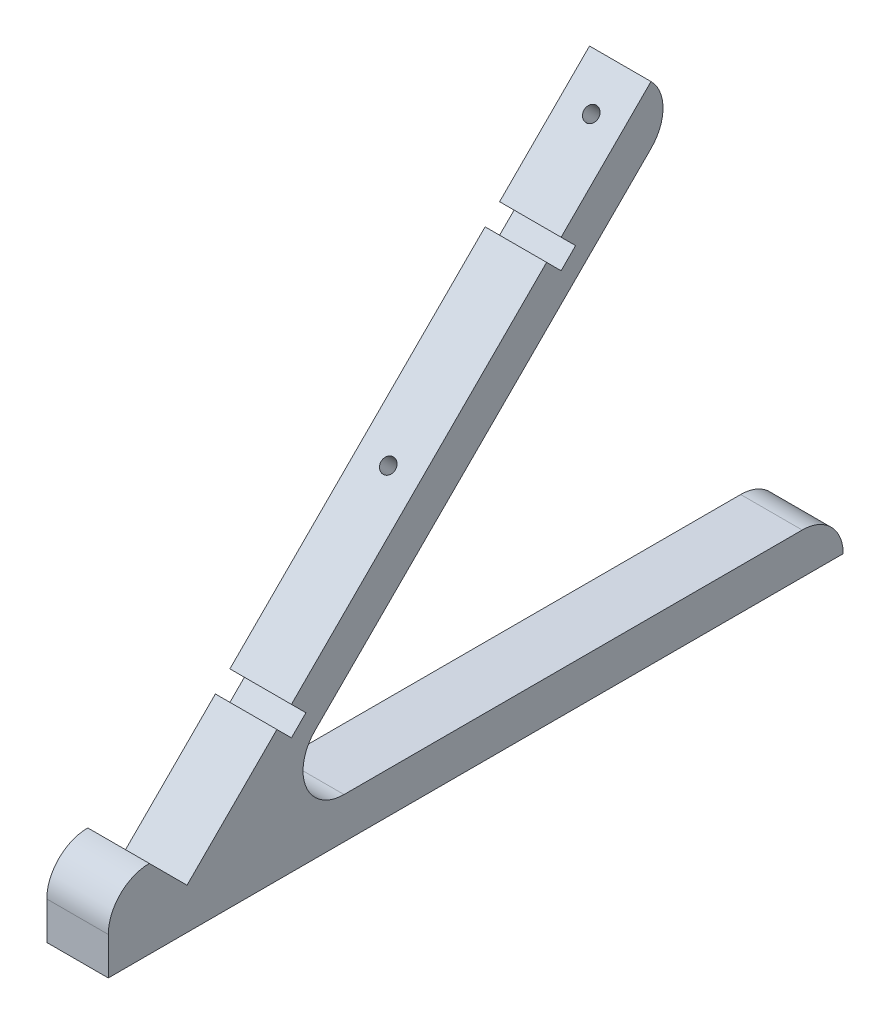
ISO-10303-21;
HEADER;
FILE_DESCRIPTION(('STEP AP214'),'2;1');
FILE_NAME('part.step','',(''),(''),'','','');
FILE_SCHEMA(('AUTOMOTIVE_DESIGN { 1 0 10303 214 1 1 1 1 }'));
ENDSEC;
DATA;
#1=APPLICATION_CONTEXT('core data for automotive mechanical design processes');
#2=APPLICATION_PROTOCOL_DEFINITION('international standard','automotive_design',2000,#1);
#3=PRODUCT_CONTEXT('',#1,'mechanical');
#4=PRODUCT('Part','Part','',(#3));
#5=PRODUCT_RELATED_PRODUCT_CATEGORY('part','',(#4));
#6=PRODUCT_DEFINITION_FORMATION('','',#4);
#7=PRODUCT_DEFINITION_CONTEXT('part definition',#1,'design');
#8=PRODUCT_DEFINITION('design','',#6,#7);
#9=PRODUCT_DEFINITION_SHAPE('','',#8);
#10=(LENGTH_UNIT() NAMED_UNIT(*) SI_UNIT(.MILLI.,.METRE.));
#11=(NAMED_UNIT(*) PLANE_ANGLE_UNIT() SI_UNIT($,.RADIAN.));
#12=(NAMED_UNIT(*) SI_UNIT($,.STERADIAN.) SOLID_ANGLE_UNIT());
#13=UNCERTAINTY_MEASURE_WITH_UNIT(LENGTH_MEASURE(1.E-05),#10,'distance_accuracy_value','');
#14=(GEOMETRIC_REPRESENTATION_CONTEXT(3) GLOBAL_UNCERTAINTY_ASSIGNED_CONTEXT((#13)) GLOBAL_UNIT_ASSIGNED_CONTEXT((#10,
#11,#12)) REPRESENTATION_CONTEXT('',''));
#15=CARTESIAN_POINT('',(0.,0.,0.));
#16=DIRECTION('',(0.,0.,1.));
#17=DIRECTION('',(1.,0.,0.));
#18=AXIS2_PLACEMENT_3D('',#15,#16,#17);
#19=CARTESIAN_POINT('',(7.49999999999999,31.0650171779807,-191.067017177981));
#20=DIRECTION('',(0.,0.707106781186556,0.707106781186539));
#21=DIRECTION('',(0.,-0.707106781186539,0.707106781186556));
#22=AXIS2_PLACEMENT_3D('',#19,#20,#21);
#23=CYLINDRICAL_SURFACE('',#22,3.25);
#24=CARTESIAN_POINT('',(7.49999999999999,108.994949366115,-113.137084989849));
#25=DIRECTION('',(0.,-0.707106781186551,-0.707106781186544));
#26=DIRECTION('',(0.,0.707106781186544,-0.707106781186551));
#27=AXIS2_PLACEMENT_3D('',#24,#25,#26);
#28=CIRCLE('',#27,3.25);
#29=CARTESIAN_POINT('',(4.24999999999998,108.994949366115,-113.137084989849));
#30=VERTEX_POINT('',#29);
#31=CARTESIAN_POINT('',(10.75,108.994949366115,-113.137084989849));
#32=VERTEX_POINT('',#31);
#33=EDGE_CURVE('E265',#30,#32,#28,.F.);
#34=ORIENTED_EDGE('',*,*,#33,.F.);
#35=CARTESIAN_POINT('',(4.24999999999998,108.994949366115,-113.137084989849));
#36=CARTESIAN_POINT('',(4.2499887486949,109.057826012128,-113.199977373551));
#37=CARTESIAN_POINT('',(4.25365005721163,109.121552136808,-113.262010395037));
#38=CARTESIAN_POINT('',(4.26823044146808,109.250174841633,-113.383946273749));
#39=CARTESIAN_POINT('',(4.27914790937797,109.315071159387,-113.443849599777));
#40=CARTESIAN_POINT('',(4.30811526542347,109.445362843574,-113.560988930049));
#41=CARTESIAN_POINT('',(4.32614635756936,109.510756453043,-113.618231522637));
#42=CARTESIAN_POINT('',(4.36916102246806,109.641645068269,-113.729884177704));
#43=CARTESIAN_POINT('',(4.39414476545723,109.70714007647,-113.784294170788));
#44=CARTESIAN_POINT('',(4.47921308096729,109.902902505674,-113.942823974806));
#45=CARTESIAN_POINT('',(4.54945167053651,110.032612108431,-114.04239072662));
#46=CARTESIAN_POINT('',(4.71475821212264,110.28582004293,-114.227760094648));
#47=CARTESIAN_POINT('',(4.80983791423929,110.409315402215,-114.313556166104));
#48=CARTESIAN_POINT('',(5.02543672701865,110.649324247526,-114.473205662517));
#49=CARTESIAN_POINT('',(5.14662702603569,110.765521794579,-114.546629135538));
#50=CARTESIAN_POINT('',(5.40958078322333,110.98223425233,-114.678291578053));
#51=CARTESIAN_POINT('',(5.55134942839706,111.082745195748,-114.736526708773));
#52=CARTESIAN_POINT('',(5.85614028033693,111.266162013554,-114.839430161954));
#53=CARTESIAN_POINT('',(6.01963418609582,111.34851723967,-114.883688247936));
#54=CARTESIAN_POINT('',(6.36036770314583,111.487680553921,-114.956745884554));
#55=CARTESIAN_POINT('',(6.53760273353639,111.544497113351,-114.985550561773));
#56=CARTESIAN_POINT('',(6.89477413537223,111.627791697362,-115.027282452795));
#57=CARTESIAN_POINT('',(7.07443904323134,111.655189065469,-115.040691765879));
#58=CARTESIAN_POINT('',(7.43631512314126,111.681111959416,-115.05338799583));
#59=CARTESIAN_POINT('',(7.61852559396988,111.67964528557,-115.052678728148));
#60=CARTESIAN_POINT('',(7.97196611800024,111.648650472136,-115.037478862738));
#61=CARTESIAN_POINT('',(8.14333064019879,111.620336356504,-115.023584466507));
#62=CARTESIAN_POINT('',(8.47847168895503,111.539035576514,-114.982770271145));
#63=CARTESIAN_POINT('',(8.64224743763057,111.486046388979,-114.955849139939));
#64=CARTESIAN_POINT('',(8.96053093935785,111.357159152409,-114.888261874277));
#65=CARTESIAN_POINT('',(9.11485540302756,111.280918319356,-114.847388900651));
#66=CARTESIAN_POINT('',(9.40782690224008,111.109405519443,-114.751730964933));
#67=CARTESIAN_POINT('',(9.54646969965905,111.014128427004,-114.696942254901));
#68=CARTESIAN_POINT('',(9.81134464063189,110.803345510384,-114.570140232694));
#69=CARTESIAN_POINT('',(9.93662578070305,110.687073071762,-114.497409919911));
#70=CARTESIAN_POINT('',(10.1632556507272,110.442574926235,-114.336345737799));
#71=CARTESIAN_POINT('',(10.2645981865664,110.31434613757,-114.24800784032));
#72=CARTESIAN_POINT('',(10.4412377484394,110.049487407895,-114.055280325705));
#73=CARTESIAN_POINT('',(10.5162777724358,109.912789138304,-113.950745972123));
#74=CARTESIAN_POINT('',(10.6062348184341,109.706504725499,-113.783820754488));
#75=CARTESIAN_POINT('',(10.632451400365,109.637546109778,-113.726499824029));
#76=CARTESIAN_POINT('',(10.6771616962903,109.499791047162,-113.60875276776));
#77=CARTESIAN_POINT('',(10.6956588585163,109.430994541539,-113.548328041978));
#78=CARTESIAN_POINT('',(10.7234385534386,109.300323548668,-113.430284122253));
#79=CARTESIAN_POINT('',(10.7333977550499,109.238380733541,-113.372898022007));
#80=CARTESIAN_POINT('',(10.7466779813754,109.115686413185,-113.256295347568));
#81=CARTESIAN_POINT('',(10.7500085493409,109.054933320159,-113.197081529741));
#82=CARTESIAN_POINT('',(10.75,108.994949366115,-113.137084989849));
#83=B_SPLINE_CURVE_WITH_KNOTS('',3,(#35,#36,#37,#38,#39,#40,#41,#42,#43,#44,#45,#46,#47,#48,#49,
#50,#51,#52,#53,#54,#55,#56,#57,#58,#59,#60,#61,#62,#63,#64,#65,#66,#67,#68,#69,#70,#71,#72,#73,
#74,#75,#76,#77,#78,#79,#80,#81,#82),.UNSPECIFIED.,.F.,.F.,(4,2,2,2,2,2,2,2,2,2,2,2,2,2,2,2,2,2,
2,2,2,2,2,4),(0.,0.266701097613438,0.533343118921862,0.799285273220854,1.06523393971387,
1.59646784402706,2.12795348376493,2.67521100352204,3.22260670599162,3.78483053108337,
4.34686772605416,4.89077883063946,5.43454294891666,5.95483514075891,6.47518054735534,
7.00360176396625,7.53216545206593,8.08683165940454,8.64164122979712,9.20172989144071,
9.48170161367224,9.76154813952839,10.0163424061383,10.2707695790361),.UNSPECIFIED.);
#84=EDGE_CURVE('E346',#30,#32,#83,.T.);
#85=ORIENTED_EDGE('',*,*,#84,.T.);
#86=EDGE_LOOP('',(#34,#85));
#87=FACE_BOUND('',#86,.T.);
#88=CARTESIAN_POINT('',(7.49999999999999,112.530483272048,-109.601551083916));
#89=DIRECTION('',(0.,0.707106781186556,0.707106781186539));
#90=DIRECTION('',(0.,-0.707106781186539,0.707106781186556));
#91=AXIS2_PLACEMENT_3D('',#88,#89,#90);
#92=CIRCLE('',#91,3.25);
#93=CARTESIAN_POINT('',(7.49999999999999,110.232386233192,-107.30345404506));
#94=VERTEX_POINT('',#93);
#95=EDGE_CURVE('E12',#94,#94,#92,.F.);
#96=ORIENTED_EDGE('',*,*,#95,.F.);
#97=EDGE_LOOP('',(#96));
#98=FACE_BOUND('',#97,.T.);
#99=ADVANCED_FACE('F80',(#87,#98),#23,.F.);
#100=CARTESIAN_POINT('',(7.5,-18.432457505077,-141.569542494923));
#101=DIRECTION('',(0.,0.707106781186556,0.707106781186539));
#102=DIRECTION('',(0.,-0.707106781186539,0.707106781186556));
#103=AXIS2_PLACEMENT_3D('',#100,#101,#102);
#104=CYLINDRICAL_SURFACE('',#103,3.25);
#105=CARTESIAN_POINT('',(7.5,59.4974746830571,-63.6396103067903));
#106=DIRECTION('',(0.,-0.707106781186551,-0.707106781186544));
#107=DIRECTION('',(0.,0.707106781186544,-0.707106781186551));
#108=AXIS2_PLACEMENT_3D('',#105,#106,#107);
#109=CIRCLE('',#108,3.25);
#110=CARTESIAN_POINT('',(7.5,61.7955717219134,-65.9377073456466));
#111=VERTEX_POINT('',#110);
#112=EDGE_CURVE('E269',#111,#111,#109,.F.);
#113=ORIENTED_EDGE('',*,*,#112,.F.);
#114=EDGE_LOOP('',(#113));
#115=FACE_BOUND('',#114,.T.);
#116=CARTESIAN_POINT('',(7.5,63.0330085889903,-60.1040764008572));
#117=DIRECTION('',(0.,0.707106781186556,0.707106781186539));
#118=DIRECTION('',(0.,-0.707106781186539,0.707106781186556));
#119=AXIS2_PLACEMENT_3D('',#116,#117,#118);
#120=CIRCLE('',#119,3.25);
#121=CARTESIAN_POINT('',(7.5,60.7349115501341,-57.8059793620009));
#122=VERTEX_POINT('',#121);
#123=EDGE_CURVE('E88',#122,#122,#120,.F.);
#124=ORIENTED_EDGE('',*,*,#123,.F.);
#125=EDGE_LOOP('',(#124));
#126=FACE_BOUND('',#125,.T.);
#127=ADVANCED_FACE('F363',(#115,#126),#104,.F.);
#128=CARTESIAN_POINT('',(0.,0.,0.));
#129=DIRECTION('',(1.,0.,0.));
#130=DIRECTION('',(0.,0.,-1.));
#131=AXIS2_PLACEMENT_3D('',#128,#129,#130);
#132=PLANE('',#131);
#133=DIRECTION('',(0.,0.707106781186556,0.707106781186539));
#134=VECTOR('',#133,1.);
#135=CARTESIAN_POINT('',(0.,97.6812408671308,-94.7523086789985));
#136=LINE('',#135,#134);
#137=CARTESIAN_POINT('',(0.,97.6812408671308,-94.7523086789985));
#138=VERTEX_POINT('',#137);
#139=CARTESIAN_POINT('',(0.,101.216774773064,-91.2167747730658));
#140=VERTEX_POINT('',#139);
#141=EDGE_CURVE('E272',#138,#140,#136,.T.);
#142=ORIENTED_EDGE('',*,*,#141,.T.);
#143=DIRECTION('',(0.,0.707106781186539,-0.707106781186556));
#144=VECTOR('',#143,1.);
#145=CARTESIAN_POINT('',(0.,5.00000000000012,5.));
#146=LINE('',#145,#144);
#147=CARTESIAN_POINT('',(0.,123.137084989846,-113.137084989849));
#148=VERTEX_POINT('',#147);
#149=EDGE_CURVE('E296',#140,#148,#146,.T.);
#150=ORIENTED_EDGE('',*,*,#149,.T.);
#151=CARTESIAN_POINT('',(0.,116.066017177981,-106.066017177983));
#152=DIRECTION('',(1.,0.,0.));
#153=DIRECTION('',(0.,0.,-1.));
#154=AXIS2_PLACEMENT_3D('',#151,#152,#153);
#155=CIRCLE('',#154,10.);
#156=CARTESIAN_POINT('',(0.,108.994949366115,-113.137084989849));
#157=VERTEX_POINT('',#156);
#158=EDGE_CURVE('E328',#148,#157,#155,.F.);
#159=ORIENTED_EDGE('',*,*,#158,.T.);
#160=DIRECTION('',(0.,-0.707106781186544,0.707106781186551));
#161=VECTOR('',#160,1.);
#162=CARTESIAN_POINT('',(0.,-2.07106781186627,-2.07106781186625));
#163=LINE('',#162,#161);
#164=CARTESIAN_POINT('',(0.,27.0710678118655,-31.2132034355983));
#165=VERTEX_POINT('',#164);
#166=EDGE_CURVE('E268',#157,#165,#163,.T.);
#167=ORIENTED_EDGE('',*,*,#166,.T.);
#168=CARTESIAN_POINT('',(0.,20.,-38.2842712474638));
#169=DIRECTION('',(1.,0.,0.));
#170=DIRECTION('',(0.,0.,-1.));
#171=AXIS2_PLACEMENT_3D('',#168,#169,#170);
#172=CIRCLE('',#171,10.);
#173=CARTESIAN_POINT('',(0.,10.,-38.2842712474638));
#174=VERTEX_POINT('',#173);
#175=EDGE_CURVE('E428',#165,#174,#172,.T.);
#176=ORIENTED_EDGE('',*,*,#175,.T.);
#177=DIRECTION('',(0.,0.,-1.));
#178=VECTOR('',#177,1.);
#179=CARTESIAN_POINT('',(0.,10.,0.));
#180=LINE('',#179,#178);
#181=CARTESIAN_POINT('',(0.,10.,-150.));
#182=VERTEX_POINT('',#181);
#183=EDGE_CURVE('E277',#174,#182,#180,.T.);
#184=ORIENTED_EDGE('',*,*,#183,.T.);
#185=CARTESIAN_POINT('',(0.,0.,-150.));
#186=DIRECTION('',(1.,0.,0.));
#187=DIRECTION('',(0.,0.,-1.));
#188=AXIS2_PLACEMENT_3D('',#185,#186,#187);
#189=CIRCLE('',#188,10.);
#190=CARTESIAN_POINT('',(0.,0.,-160.));
#191=VERTEX_POINT('',#190);
#192=EDGE_CURVE('E326',#182,#191,#189,.F.);
#193=ORIENTED_EDGE('',*,*,#192,.T.);
#194=DIRECTION('',(0.,0.,-1.));
#195=VECTOR('',#194,1.);
#196=CARTESIAN_POINT('',(0.,0.,0.));
#197=LINE('',#196,#195);
#198=CARTESIAN_POINT('',(0.,0.,19.1923881554251));
#199=VERTEX_POINT('',#198);
#200=EDGE_CURVE('E306',#199,#191,#197,.T.);
#201=ORIENTED_EDGE('',*,*,#200,.F.);
#202=DIRECTION('',(0.,1.,0.));
#203=VECTOR('',#202,1.);
#204=CARTESIAN_POINT('',(0.,0.,19.1923881554251));
#205=LINE('',#204,#203);
#206=CARTESIAN_POINT('',(0.,9.19238815542513,19.1923881554251));
#207=VERTEX_POINT('',#206);
#208=EDGE_CURVE('E303',#199,#207,#205,.T.);
#209=ORIENTED_EDGE('',*,*,#208,.T.);
#210=CARTESIAN_POINT('',(0.,9.19238815542513,9.1923881554251));
#211=DIRECTION('',(1.,0.,0.));
#212=DIRECTION('',(0.,0.,-1.));
#213=AXIS2_PLACEMENT_3D('',#210,#211,#212);
#214=CIRCLE('',#213,10.);
#215=CARTESIAN_POINT('',(0.,19.1923881554251,9.1923881554251));
#216=VERTEX_POINT('',#215);
#217=EDGE_CURVE('E330',#207,#216,#214,.F.);
#218=ORIENTED_EDGE('',*,*,#217,.T.);
#219=DIRECTION('',(0.,0.707106781186549,0.707106781186546));
#220=VECTOR('',#219,1.);
#221=CARTESIAN_POINT('',(0.,4.99999999999998,-5.));
#222=LINE('',#221,#220);
#223=CARTESIAN_POINT('',(0.,10.,0.));
#224=VERTEX_POINT('',#223);
#225=EDGE_CURVE('E300',#224,#216,#222,.T.);
#226=ORIENTED_EDGE('',*,*,#225,.F.);
#227=CARTESIAN_POINT('',(0.,31.9203102167827,-21.9203102167832));
#228=VERTEX_POINT('',#227);
#229=EDGE_CURVE('E297',#224,#228,#146,.T.);
#230=ORIENTED_EDGE('',*,*,#229,.T.);
#231=DIRECTION('',(0.,0.707106781186556,0.707106781186539));
#232=VECTOR('',#231,1.);
#233=CARTESIAN_POINT('',(0.,28.3847763108499,-25.4558441227159));
#234=LINE('',#233,#232);
#235=CARTESIAN_POINT('',(0.,28.3847763108499,-25.4558441227159));
#236=VERTEX_POINT('',#235);
#237=EDGE_CURVE('E103',#236,#228,#234,.T.);
#238=ORIENTED_EDGE('',*,*,#237,.F.);
#239=DIRECTION('',(0.,-0.707106781186539,0.707106781186556));
#240=VECTOR('',#239,1.);
#241=CARTESIAN_POINT('',(0.,1.46446609406735,1.46446609406731));
#242=LINE('',#241,#240);
#243=CARTESIAN_POINT('',(0.,31.9203102167826,-28.9913780286487));
#244=VERTEX_POINT('',#243);
#245=EDGE_CURVE('E239',#244,#236,#242,.T.);
#246=ORIENTED_EDGE('',*,*,#245,.F.);
#247=DIRECTION('',(0.,0.707106781186556,0.707106781186539));
#248=VECTOR('',#247,1.);
#249=CARTESIAN_POINT('',(0.,31.9203102167826,-28.9913780286487));
#250=LINE('',#249,#248);
#251=CARTESIAN_POINT('',(0.,35.4558441227154,-25.455844122716));
#252=VERTEX_POINT('',#251);
#253=EDGE_CURVE('E256',#244,#252,#250,.T.);
#254=ORIENTED_EDGE('',*,*,#253,.T.);
#255=CARTESIAN_POINT('',(0.,97.6812408671309,-87.681240867133));
#256=VERTEX_POINT('',#255);
#257=EDGE_CURVE('E232',#252,#256,#146,.T.);
#258=ORIENTED_EDGE('',*,*,#257,.T.);
#259=DIRECTION('',(0.,0.707106781186556,0.707106781186539));
#260=VECTOR('',#259,1.);
#261=CARTESIAN_POINT('',(0.,94.145706961198,-91.2167747730657));
#262=LINE('',#261,#260);
#263=CARTESIAN_POINT('',(0.,94.145706961198,-91.2167747730657));
#264=VERTEX_POINT('',#263);
#265=EDGE_CURVE('E95',#264,#256,#262,.T.);
#266=ORIENTED_EDGE('',*,*,#265,.F.);
#267=DIRECTION('',(0.,-0.707106781186539,0.707106781186556));
#268=VECTOR('',#267,1.);
#269=CARTESIAN_POINT('',(0.,1.46446609406735,1.46446609406731));
#270=LINE('',#269,#268);
#271=EDGE_CURVE('E218',#138,#264,#270,.T.);
#272=ORIENTED_EDGE('',*,*,#271,.F.);
#273=EDGE_LOOP('',(#142,#150,#159,#167,#176,#184,#193,#201,#209,#218,#226,#230,#238,#246,#254,
#258,#266,#272));
#274=FACE_BOUND('',#273,.T.);
#275=ADVANCED_FACE('F229',(#274),#132,.F.);
#276=CARTESIAN_POINT('',(15.,0.,0.));
#277=DIRECTION('',(1.,0.,0.));
#278=DIRECTION('',(0.,0.,-1.));
#279=AXIS2_PLACEMENT_3D('',#276,#277,#278);
#280=PLANE('',#279);
#281=DIRECTION('',(0.,0.707106781186539,-0.707106781186556));
#282=VECTOR('',#281,1.);
#283=CARTESIAN_POINT('',(15.,5.00000000000012,5.));
#284=LINE('',#283,#282);
#285=CARTESIAN_POINT('',(15.,101.216774773064,-91.2167747730658));
#286=VERTEX_POINT('',#285);
#287=CARTESIAN_POINT('',(15.,123.137084989846,-113.137084989849));
#288=VERTEX_POINT('',#287);
#289=EDGE_CURVE('E276',#286,#288,#284,.T.);
#290=ORIENTED_EDGE('',*,*,#289,.F.);
#291=DIRECTION('',(0.,0.707106781186556,0.707106781186539));
#292=VECTOR('',#291,1.);
#293=CARTESIAN_POINT('',(15.,97.6812408671308,-94.7523086789985));
#294=LINE('',#293,#292);
#295=CARTESIAN_POINT('',(15.,97.6812408671308,-94.7523086789985));
#296=VERTEX_POINT('',#295);
#297=EDGE_CURVE('E234',#296,#286,#294,.T.);
#298=ORIENTED_EDGE('',*,*,#297,.F.);
#299=DIRECTION('',(0.,0.707106781186539,-0.707106781186556));
#300=VECTOR('',#299,1.);
#301=CARTESIAN_POINT('',(15.,1.46446609406735,1.46446609406732));
#302=LINE('',#301,#300);
#303=CARTESIAN_POINT('',(15.,94.1457069611981,-91.2167747730657));
#304=VERTEX_POINT('',#303);
#305=EDGE_CURVE('E217',#304,#296,#302,.T.);
#306=ORIENTED_EDGE('',*,*,#305,.F.);
#307=DIRECTION('',(0.,0.707106781186556,0.707106781186539));
#308=VECTOR('',#307,1.);
#309=CARTESIAN_POINT('',(15.,94.1457069611981,-91.2167747730657));
#310=LINE('',#309,#308);
#311=CARTESIAN_POINT('',(15.,97.6812408671309,-87.681240867133));
#312=VERTEX_POINT('',#311);
#313=EDGE_CURVE('E213',#304,#312,#310,.T.);
#314=ORIENTED_EDGE('',*,*,#313,.T.);
#315=CARTESIAN_POINT('',(15.,35.4558441227154,-25.455844122716));
#316=VERTEX_POINT('',#315);
#317=EDGE_CURVE('E282',#316,#312,#284,.T.);
#318=ORIENTED_EDGE('',*,*,#317,.F.);
#319=DIRECTION('',(0.,0.707106781186556,0.707106781186539));
#320=VECTOR('',#319,1.);
#321=CARTESIAN_POINT('',(15.,31.9203102167826,-28.9913780286487));
#322=LINE('',#321,#320);
#323=CARTESIAN_POINT('',(15.,31.9203102167826,-28.9913780286487));
#324=VERTEX_POINT('',#323);
#325=EDGE_CURVE('E259',#324,#316,#322,.T.);
#326=ORIENTED_EDGE('',*,*,#325,.F.);
#327=DIRECTION('',(0.,0.707106781186539,-0.707106781186556));
#328=VECTOR('',#327,1.);
#329=CARTESIAN_POINT('',(15.,1.46446609406735,1.46446609406732));
#330=LINE('',#329,#328);
#331=CARTESIAN_POINT('',(15.,28.3847763108499,-25.4558441227159));
#332=VERTEX_POINT('',#331);
#333=EDGE_CURVE('E246',#332,#324,#330,.T.);
#334=ORIENTED_EDGE('',*,*,#333,.F.);
#335=DIRECTION('',(0.,0.707106781186556,0.707106781186539));
#336=VECTOR('',#335,1.);
#337=CARTESIAN_POINT('',(15.,28.3847763108499,-25.4558441227159));
#338=LINE('',#337,#336);
#339=CARTESIAN_POINT('',(15.,31.9203102167827,-21.9203102167832));
#340=VERTEX_POINT('',#339);
#341=EDGE_CURVE('E261',#332,#340,#338,.T.);
#342=ORIENTED_EDGE('',*,*,#341,.T.);
#343=CARTESIAN_POINT('',(15.,10.,0.));
#344=VERTEX_POINT('',#343);
#345=EDGE_CURVE('E278',#344,#340,#284,.T.);
#346=ORIENTED_EDGE('',*,*,#345,.F.);
#347=DIRECTION('',(0.,0.707106781186549,0.707106781186546));
#348=VECTOR('',#347,1.);
#349=CARTESIAN_POINT('',(15.,4.99999999999998,-5.));
#350=LINE('',#349,#348);
#351=CARTESIAN_POINT('',(15.,19.1923881554251,9.1923881554251));
#352=VERTEX_POINT('',#351);
#353=EDGE_CURVE('E281',#344,#352,#350,.T.);
#354=ORIENTED_EDGE('',*,*,#353,.T.);
#355=CARTESIAN_POINT('',(15.,9.19238815542513,9.1923881554251));
#356=DIRECTION('',(1.,0.,0.));
#357=DIRECTION('',(0.,0.,-1.));
#358=AXIS2_PLACEMENT_3D('',#355,#356,#357);
#359=CIRCLE('',#358,10.);
#360=CARTESIAN_POINT('',(15.,9.19238815542513,19.1923881554251));
#361=VERTEX_POINT('',#360);
#362=EDGE_CURVE('E337',#352,#361,#359,.T.);
#363=ORIENTED_EDGE('',*,*,#362,.T.);
#364=DIRECTION('',(0.,1.,0.));
#365=VECTOR('',#364,1.);
#366=CARTESIAN_POINT('',(15.,0.,19.1923881554251));
#367=LINE('',#366,#365);
#368=CARTESIAN_POINT('',(15.,0.,19.1923881554251));
#369=VERTEX_POINT('',#368);
#370=EDGE_CURVE('E285',#369,#361,#367,.T.);
#371=ORIENTED_EDGE('',*,*,#370,.F.);
#372=DIRECTION('',(0.,0.,-1.));
#373=VECTOR('',#372,1.);
#374=CARTESIAN_POINT('',(15.,0.,0.));
#375=LINE('',#374,#373);
#376=CARTESIAN_POINT('',(15.,0.,-160.));
#377=VERTEX_POINT('',#376);
#378=EDGE_CURVE('E288',#369,#377,#375,.T.);
#379=ORIENTED_EDGE('',*,*,#378,.T.);
#380=CARTESIAN_POINT('',(15.,0.,-150.));
#381=DIRECTION('',(1.,0.,0.));
#382=DIRECTION('',(0.,0.,-1.));
#383=AXIS2_PLACEMENT_3D('',#380,#381,#382);
#384=CIRCLE('',#383,10.);
#385=CARTESIAN_POINT('',(15.,10.,-150.));
#386=VERTEX_POINT('',#385);
#387=EDGE_CURVE('E332',#377,#386,#384,.T.);
#388=ORIENTED_EDGE('',*,*,#387,.T.);
#389=DIRECTION('',(0.,0.,-1.));
#390=VECTOR('',#389,1.);
#391=CARTESIAN_POINT('',(15.,10.,0.));
#392=LINE('',#391,#390);
#393=CARTESIAN_POINT('',(15.,10.,-38.2842712474638));
#394=VERTEX_POINT('',#393);
#395=EDGE_CURVE('E290',#394,#386,#392,.T.);
#396=ORIENTED_EDGE('',*,*,#395,.F.);
#397=CARTESIAN_POINT('',(15.,20.,-38.2842712474638));
#398=DIRECTION('',(1.,0.,0.));
#399=DIRECTION('',(0.,0.,-1.));
#400=AXIS2_PLACEMENT_3D('',#397,#398,#399);
#401=CIRCLE('',#400,10.);
#402=CARTESIAN_POINT('',(15.,27.0710678118655,-31.2132034355983));
#403=VERTEX_POINT('',#402);
#404=EDGE_CURVE('E429',#394,#403,#401,.F.);
#405=ORIENTED_EDGE('',*,*,#404,.T.);
#406=DIRECTION('',(0.,-0.707106781186544,0.707106781186551));
#407=VECTOR('',#406,1.);
#408=CARTESIAN_POINT('',(15.,-2.07106781186627,-2.07106781186625));
#409=LINE('',#408,#407);
#410=CARTESIAN_POINT('',(15.,108.994949366115,-113.137084989849));
#411=VERTEX_POINT('',#410);
#412=EDGE_CURVE('E273',#411,#403,#409,.T.);
#413=ORIENTED_EDGE('',*,*,#412,.F.);
#414=CARTESIAN_POINT('',(15.,116.066017177981,-106.066017177983));
#415=DIRECTION('',(1.,0.,0.));
#416=DIRECTION('',(0.,0.,-1.));
#417=AXIS2_PLACEMENT_3D('',#414,#415,#416);
#418=CIRCLE('',#417,10.);
#419=EDGE_CURVE('E334',#411,#288,#418,.T.);
#420=ORIENTED_EDGE('',*,*,#419,.T.);
#421=EDGE_LOOP('',(#290,#298,#306,#314,#318,#326,#334,#342,#346,#354,#363,#371,#379,#388,#396,
#405,#413,#420));
#422=FACE_BOUND('',#421,.T.);
#423=ADVANCED_FACE('F370',(#422),#280,.T.);
#424=CARTESIAN_POINT('',(15.,5.00000000000012,5.));
#425=DIRECTION('',(0.,0.707106781186556,0.707106781186539));
#426=DIRECTION('',(0.,-0.707106781186539,0.707106781186556));
#427=AXIS2_PLACEMENT_3D('',#424,#425,#426);
#428=PLANE('',#427);
#429=ORIENTED_EDGE('',*,*,#149,.F.);
#430=DIRECTION('',(1.,0.,0.));
#431=VECTOR('',#430,1.);
#432=CARTESIAN_POINT('',(0.,101.216774773064,-91.2167747730658));
#433=LINE('',#432,#431);
#434=EDGE_CURVE('E226',#140,#286,#433,.T.);
#435=ORIENTED_EDGE('',*,*,#434,.T.);
#436=ORIENTED_EDGE('',*,*,#289,.T.);
#437=DIRECTION('',(-1.,0.,0.));
#438=VECTOR('',#437,1.);
#439=CARTESIAN_POINT('',(15.,123.137084989846,-113.137084989849));
#440=LINE('',#439,#438);
#441=EDGE_CURVE('E320',#288,#148,#440,.T.);
#442=ORIENTED_EDGE('',*,*,#441,.T.);
#443=EDGE_LOOP('',(#429,#435,#436,#442));
#444=FACE_BOUND('',#443,.T.);
#445=CARTESIAN_POINT('',(7.5,116.066017177981,-106.066017177983));
#446=DIRECTION('',(0.,0.707106781186556,0.707106781186539));
#447=DIRECTION('',(0.,-0.707106781186539,0.707106781186556));
#448=AXIS2_PLACEMENT_3D('',#445,#446,#447);
#449=CIRCLE('',#448,1.75);
#450=CARTESIAN_POINT('',(7.5,114.828580310904,-104.828580310907));
#451=VERTEX_POINT('',#450);
#452=EDGE_CURVE('E507',#451,#451,#449,.T.);
#453=ORIENTED_EDGE('',*,*,#452,.F.);
#454=EDGE_LOOP('',(#453));
#455=FACE_BOUND('',#454,.T.);
#456=ADVANCED_FACE('F373',(#444,#455),#428,.T.);
#457=DIRECTION('',(1.,0.,0.));
#458=VECTOR('',#457,1.);
#459=CARTESIAN_POINT('',(0.,97.6812408671308,-87.681240867133));
#460=LINE('',#459,#458);
#461=EDGE_CURVE('E258',#256,#312,#460,.T.);
#462=ORIENTED_EDGE('',*,*,#461,.F.);
#463=ORIENTED_EDGE('',*,*,#257,.F.);
#464=DIRECTION('',(1.,0.,0.));
#465=VECTOR('',#464,1.);
#466=CARTESIAN_POINT('',(0.,35.4558441227154,-25.455844122716));
#467=LINE('',#466,#465);
#468=EDGE_CURVE('E243',#252,#316,#467,.T.);
#469=ORIENTED_EDGE('',*,*,#468,.T.);
#470=ORIENTED_EDGE('',*,*,#317,.T.);
#471=EDGE_LOOP('',(#462,#463,#469,#470));
#472=FACE_BOUND('',#471,.T.);
#473=CARTESIAN_POINT('',(7.5,66.5685424949231,-56.5685424949245));
#474=DIRECTION('',(0.,0.707106781186556,0.707106781186539));
#475=DIRECTION('',(0.,-0.707106781186539,0.707106781186556));
#476=AXIS2_PLACEMENT_3D('',#473,#474,#475);
#477=CIRCLE('',#476,1.75);
#478=CARTESIAN_POINT('',(7.5,65.3311056278467,-55.331105627848));
#479=VERTEX_POINT('',#478);
#480=EDGE_CURVE('E506',#479,#479,#477,.T.);
#481=ORIENTED_EDGE('',*,*,#480,.F.);
#482=EDGE_LOOP('',(#481));
#483=FACE_BOUND('',#482,.T.);
#484=ADVANCED_FACE('F383',(#472,#483),#428,.T.);
#485=CARTESIAN_POINT('',(15.,0.,0.));
#486=DIRECTION('',(0.,1.,0.));
#487=DIRECTION('',(0.,0.,1.));
#488=AXIS2_PLACEMENT_3D('',#485,#486,#487);
#489=PLANE('',#488);
#490=ORIENTED_EDGE('',*,*,#200,.T.);
#491=DIRECTION('',(-1.,0.,0.));
#492=VECTOR('',#491,1.);
#493=CARTESIAN_POINT('',(15.,0.,-160.));
#494=LINE('',#493,#492);
#495=EDGE_CURVE('E293',#377,#191,#494,.T.);
#496=ORIENTED_EDGE('',*,*,#495,.F.);
#497=ORIENTED_EDGE('',*,*,#378,.F.);
#498=DIRECTION('',(-1.,0.,0.));
#499=VECTOR('',#498,1.);
#500=CARTESIAN_POINT('',(15.,0.,19.1923881554251));
#501=LINE('',#500,#499);
#502=EDGE_CURVE('E313',#369,#199,#501,.T.);
#503=ORIENTED_EDGE('',*,*,#502,.T.);
#504=EDGE_LOOP('',(#490,#496,#497,#503));
#505=FACE_BOUND('',#504,.T.);
#506=ADVANCED_FACE('F384',(#505),#489,.F.);
#507=CARTESIAN_POINT('',(15.,0.,19.1923881554251));
#508=DIRECTION('',(0.,0.,1.));
#509=DIRECTION('',(1.,0.,0.));
#510=AXIS2_PLACEMENT_3D('',#507,#508,#509);
#511=PLANE('',#510);
#512=ORIENTED_EDGE('',*,*,#370,.T.);
#513=DIRECTION('',(-1.,0.,0.));
#514=VECTOR('',#513,1.);
#515=CARTESIAN_POINT('',(0.,9.19238815542513,19.1923881554251));
#516=LINE('',#515,#514);
#517=EDGE_CURVE('E323',#361,#207,#516,.T.);
#518=ORIENTED_EDGE('',*,*,#517,.T.);
#519=ORIENTED_EDGE('',*,*,#208,.F.);
#520=ORIENTED_EDGE('',*,*,#502,.F.);
#521=EDGE_LOOP('',(#512,#518,#519,#520));
#522=FACE_BOUND('',#521,.T.);
#523=ADVANCED_FACE('F381',(#522),#511,.T.);
#524=CARTESIAN_POINT('',(15.,10.,0.));
#525=DIRECTION('',(0.,1.,0.));
#526=DIRECTION('',(0.,0.,1.));
#527=AXIS2_PLACEMENT_3D('',#524,#525,#526);
#528=PLANE('',#527);
#529=ORIENTED_EDGE('',*,*,#395,.T.);
#530=DIRECTION('',(-1.,0.,0.));
#531=VECTOR('',#530,1.);
#532=CARTESIAN_POINT('',(0.,10.,-150.));
#533=LINE('',#532,#531);
#534=EDGE_CURVE('E426',#386,#182,#533,.T.);
#535=ORIENTED_EDGE('',*,*,#534,.T.);
#536=ORIENTED_EDGE('',*,*,#183,.F.);
#537=DIRECTION('',(-1.,0.,0.));
#538=VECTOR('',#537,1.);
#539=CARTESIAN_POINT('',(15.,10.,-38.2842712474638));
#540=LINE('',#539,#538);
#541=EDGE_CURVE('E354',#174,#394,#540,.F.);
#542=ORIENTED_EDGE('',*,*,#541,.T.);
#543=EDGE_LOOP('',(#529,#535,#536,#542));
#544=FACE_BOUND('',#543,.T.);
#545=ADVANCED_FACE('F377',(#544),#528,.T.);
#546=CARTESIAN_POINT('',(15.,-2.07106781186627,-2.07106781186625));
#547=DIRECTION('',(0.,-0.707106781186551,-0.707106781186544));
#548=DIRECTION('',(0.,0.707106781186544,-0.707106781186551));
#549=AXIS2_PLACEMENT_3D('',#546,#547,#548);
#550=PLANE('',#549);
#551=ORIENTED_EDGE('',*,*,#166,.F.);
#552=DIRECTION('',(-1.,0.,0.));
#553=VECTOR('',#552,1.);
#554=CARTESIAN_POINT('',(15.,108.994949366115,-113.137084989849));
#555=LINE('',#554,#553);
#556=EDGE_CURVE('E344',#157,#30,#555,.F.);
#557=ORIENTED_EDGE('',*,*,#556,.T.);
#558=ORIENTED_EDGE('',*,*,#33,.T.);
#559=DIRECTION('',(-1.,0.,0.));
#560=VECTOR('',#559,1.);
#561=CARTESIAN_POINT('',(15.,108.994949366115,-113.137084989849));
#562=LINE('',#561,#560);
#563=EDGE_CURVE('E342',#32,#411,#562,.F.);
#564=ORIENTED_EDGE('',*,*,#563,.T.);
#565=ORIENTED_EDGE('',*,*,#412,.T.);
#566=DIRECTION('',(-1.,0.,0.));
#567=VECTOR('',#566,1.);
#568=CARTESIAN_POINT('',(0.,27.0710678118655,-31.2132034355983));
#569=LINE('',#568,#567);
#570=EDGE_CURVE('E339',#403,#165,#569,.T.);
#571=ORIENTED_EDGE('',*,*,#570,.T.);
#572=EDGE_LOOP('',(#551,#557,#558,#564,#565,#571));
#573=FACE_BOUND('',#572,.T.);
#574=ORIENTED_EDGE('',*,*,#112,.T.);
#575=EDGE_LOOP('',(#574));
#576=FACE_BOUND('',#575,.T.);
#577=ADVANCED_FACE('F380',(#573,#576),#550,.T.);
#578=DIRECTION('',(1.,0.,0.));
#579=VECTOR('',#578,1.);
#580=CARTESIAN_POINT('',(0.,31.9203102167827,-21.9203102167832));
#581=LINE('',#580,#579);
#582=EDGE_CURVE('E251',#228,#340,#581,.T.);
#583=ORIENTED_EDGE('',*,*,#582,.F.);
#584=ORIENTED_EDGE('',*,*,#229,.F.);
#585=DIRECTION('',(-1.,0.,0.));
#586=VECTOR('',#585,1.);
#587=CARTESIAN_POINT('',(15.,10.,0.));
#588=LINE('',#587,#586);
#589=EDGE_CURVE('E318',#344,#224,#588,.T.);
#590=ORIENTED_EDGE('',*,*,#589,.F.);
#591=ORIENTED_EDGE('',*,*,#345,.T.);
#592=EDGE_LOOP('',(#583,#584,#590,#591));
#593=FACE_BOUND('',#592,.T.);
#594=ADVANCED_FACE('F395',(#593),#428,.T.);
#595=CARTESIAN_POINT('',(15.,4.99999999999998,-5.));
#596=DIRECTION('',(0.,-0.707106781186546,0.707106781186549));
#597=DIRECTION('',(0.,-0.707106781186549,-0.707106781186546));
#598=AXIS2_PLACEMENT_3D('',#595,#596,#597);
#599=PLANE('',#598);
#600=ORIENTED_EDGE('',*,*,#225,.T.);
#601=DIRECTION('',(-1.,0.,0.));
#602=VECTOR('',#601,1.);
#603=CARTESIAN_POINT('',(15.,19.1923881554251,9.1923881554251));
#604=LINE('',#603,#602);
#605=EDGE_CURVE('E315',#352,#216,#604,.T.);
#606=ORIENTED_EDGE('',*,*,#605,.F.);
#607=ORIENTED_EDGE('',*,*,#353,.F.);
#608=ORIENTED_EDGE('',*,*,#589,.T.);
#609=EDGE_LOOP('',(#600,#606,#607,#608));
#610=FACE_BOUND('',#609,.T.);
#611=ADVANCED_FACE('F388',(#610),#599,.F.);
#612=CARTESIAN_POINT('',(15.,9.19238815542513,9.1923881554251));
#613=DIRECTION('',(1.,0.,0.));
#614=DIRECTION('',(0.,0.,-1.));
#615=AXIS2_PLACEMENT_3D('',#612,#613,#614);
#616=CYLINDRICAL_SURFACE('',#615,10.);
#617=ORIENTED_EDGE('',*,*,#362,.F.);
#618=ORIENTED_EDGE('',*,*,#605,.T.);
#619=ORIENTED_EDGE('',*,*,#217,.F.);
#620=ORIENTED_EDGE('',*,*,#517,.F.);
#621=EDGE_LOOP('',(#617,#618,#619,#620));
#622=FACE_BOUND('',#621,.T.);
#623=ADVANCED_FACE('F392',(#622),#616,.T.);
#624=CARTESIAN_POINT('',(15.,116.066017177981,-106.066017177983));
#625=DIRECTION('',(-1.,0.,0.));
#626=DIRECTION('',(0.,0.,1.));
#627=AXIS2_PLACEMENT_3D('',#624,#625,#626);
#628=CYLINDRICAL_SURFACE('',#627,10.);
#629=ORIENTED_EDGE('',*,*,#84,.F.);
#630=ORIENTED_EDGE('',*,*,#556,.F.);
#631=ORIENTED_EDGE('',*,*,#158,.F.);
#632=ORIENTED_EDGE('',*,*,#441,.F.);
#633=ORIENTED_EDGE('',*,*,#419,.F.);
#634=ORIENTED_EDGE('',*,*,#563,.F.);
#635=EDGE_LOOP('',(#629,#630,#631,#632,#633,#634));
#636=FACE_BOUND('',#635,.T.);
#637=ADVANCED_FACE('F356',(#636),#628,.T.);
#638=CARTESIAN_POINT('',(15.,0.,-150.));
#639=DIRECTION('',(1.,0.,0.));
#640=DIRECTION('',(0.,0.,-1.));
#641=AXIS2_PLACEMENT_3D('',#638,#639,#640);
#642=CYLINDRICAL_SURFACE('',#641,10.);
#643=ORIENTED_EDGE('',*,*,#387,.F.);
#644=ORIENTED_EDGE('',*,*,#495,.T.);
#645=ORIENTED_EDGE('',*,*,#192,.F.);
#646=ORIENTED_EDGE('',*,*,#534,.F.);
#647=EDGE_LOOP('',(#643,#644,#645,#646));
#648=FACE_BOUND('',#647,.T.);
#649=ADVANCED_FACE('F407',(#648),#642,.T.);
#650=CARTESIAN_POINT('',(15.,20.,-38.2842712474638));
#651=DIRECTION('',(1.,0.,0.));
#652=DIRECTION('',(0.,0.,-1.));
#653=AXIS2_PLACEMENT_3D('',#650,#651,#652);
#654=CYLINDRICAL_SURFACE('',#653,10.);
#655=ORIENTED_EDGE('',*,*,#404,.F.);
#656=ORIENTED_EDGE('',*,*,#541,.F.);
#657=ORIENTED_EDGE('',*,*,#175,.F.);
#658=ORIENTED_EDGE('',*,*,#570,.F.);
#659=EDGE_LOOP('',(#655,#656,#657,#658));
#660=FACE_BOUND('',#659,.T.);
#661=ADVANCED_FACE('F82',(#660),#654,.F.);
#662=CARTESIAN_POINT('',(0.,31.9203102167826,-28.9913780286487));
#663=DIRECTION('',(0.,-0.707106781186539,0.707106781186556));
#664=DIRECTION('',(0.,-0.707106781186556,-0.707106781186539));
#665=AXIS2_PLACEMENT_3D('',#662,#663,#664);
#666=PLANE('',#665);
#667=ORIENTED_EDGE('',*,*,#468,.F.);
#668=ORIENTED_EDGE('',*,*,#253,.F.);
#669=DIRECTION('',(1.,0.,0.));
#670=VECTOR('',#669,1.);
#671=CARTESIAN_POINT('',(0.,31.9203102167826,-28.9913780286487));
#672=LINE('',#671,#670);
#673=EDGE_CURVE('E249',#244,#324,#672,.T.);
#674=ORIENTED_EDGE('',*,*,#673,.T.);
#675=ORIENTED_EDGE('',*,*,#325,.T.);
#676=EDGE_LOOP('',(#667,#668,#674,#675));
#677=FACE_BOUND('',#676,.T.);
#678=ADVANCED_FACE('F465',(#677),#666,.T.);
#679=CARTESIAN_POINT('',(0.,28.3847763108499,-25.4558441227159));
#680=DIRECTION('',(0.,-0.707106781186539,0.707106781186556));
#681=DIRECTION('',(0.,-0.707106781186556,-0.707106781186539));
#682=AXIS2_PLACEMENT_3D('',#679,#680,#681);
#683=PLANE('',#682);
#684=ORIENTED_EDGE('',*,*,#582,.T.);
#685=ORIENTED_EDGE('',*,*,#341,.F.);
#686=DIRECTION('',(1.,0.,0.));
#687=VECTOR('',#686,1.);
#688=CARTESIAN_POINT('',(0.,28.3847763108499,-25.4558441227159));
#689=LINE('',#688,#687);
#690=EDGE_CURVE('E242',#236,#332,#689,.T.);
#691=ORIENTED_EDGE('',*,*,#690,.F.);
#692=ORIENTED_EDGE('',*,*,#237,.T.);
#693=EDGE_LOOP('',(#684,#685,#691,#692));
#694=FACE_BOUND('',#693,.T.);
#695=ADVANCED_FACE('F365',(#694),#683,.F.);
#696=CARTESIAN_POINT('',(0.,1.46446609406735,1.46446609406731));
#697=DIRECTION('',(0.,0.707106781186556,0.707106781186539));
#698=DIRECTION('',(0.,-0.707106781186539,0.707106781186556));
#699=AXIS2_PLACEMENT_3D('',#696,#697,#698);
#700=PLANE('',#699);
#701=ORIENTED_EDGE('',*,*,#245,.T.);
#702=ORIENTED_EDGE('',*,*,#690,.T.);
#703=ORIENTED_EDGE('',*,*,#333,.T.);
#704=ORIENTED_EDGE('',*,*,#673,.F.);
#705=EDGE_LOOP('',(#701,#702,#703,#704));
#706=FACE_BOUND('',#705,.T.);
#707=ADVANCED_FACE('F459',(#706),#700,.T.);
#708=CARTESIAN_POINT('',(0.,97.6812408671308,-94.7523086789985));
#709=DIRECTION('',(0.,-0.707106781186539,0.707106781186556));
#710=DIRECTION('',(0.,-0.707106781186556,-0.707106781186539));
#711=AXIS2_PLACEMENT_3D('',#708,#709,#710);
#712=PLANE('',#711);
#713=ORIENTED_EDGE('',*,*,#434,.F.);
#714=ORIENTED_EDGE('',*,*,#141,.F.);
#715=DIRECTION('',(1.,0.,0.));
#716=VECTOR('',#715,1.);
#717=CARTESIAN_POINT('',(0.,97.6812408671308,-94.7523086789985));
#718=LINE('',#717,#716);
#719=EDGE_CURVE('E223',#138,#296,#718,.T.);
#720=ORIENTED_EDGE('',*,*,#719,.T.);
#721=ORIENTED_EDGE('',*,*,#297,.T.);
#722=EDGE_LOOP('',(#713,#714,#720,#721));
#723=FACE_BOUND('',#722,.T.);
#724=ADVANCED_FACE('F456',(#723),#712,.T.);
#725=CARTESIAN_POINT('',(0.,94.1457069611981,-91.2167747730657));
#726=DIRECTION('',(0.,-0.707106781186539,0.707106781186556));
#727=DIRECTION('',(0.,-0.707106781186556,-0.707106781186539));
#728=AXIS2_PLACEMENT_3D('',#725,#726,#727);
#729=PLANE('',#728);
#730=ORIENTED_EDGE('',*,*,#461,.T.);
#731=ORIENTED_EDGE('',*,*,#313,.F.);
#732=DIRECTION('',(1.,0.,0.));
#733=VECTOR('',#732,1.);
#734=CARTESIAN_POINT('',(0.,94.1457069611981,-91.2167747730657));
#735=LINE('',#734,#733);
#736=EDGE_CURVE('E209',#264,#304,#735,.T.);
#737=ORIENTED_EDGE('',*,*,#736,.F.);
#738=ORIENTED_EDGE('',*,*,#265,.T.);
#739=EDGE_LOOP('',(#730,#731,#737,#738));
#740=FACE_BOUND('',#739,.T.);
#741=ADVANCED_FACE('F211',(#740),#729,.F.);
#742=CARTESIAN_POINT('',(0.,1.46446609406735,1.46446609406731));
#743=DIRECTION('',(0.,0.707106781186556,0.707106781186539));
#744=DIRECTION('',(0.,-0.707106781186539,0.707106781186556));
#745=AXIS2_PLACEMENT_3D('',#742,#743,#744);
#746=PLANE('',#745);
#747=ORIENTED_EDGE('',*,*,#271,.T.);
#748=ORIENTED_EDGE('',*,*,#736,.T.);
#749=ORIENTED_EDGE('',*,*,#305,.T.);
#750=ORIENTED_EDGE('',*,*,#719,.F.);
#751=EDGE_LOOP('',(#747,#748,#749,#750));
#752=FACE_BOUND('',#751,.T.);
#753=ADVANCED_FACE('F222',(#752),#746,.T.);
#754=CARTESIAN_POINT('',(7.5,63.0330085889903,-60.1040764008572));
#755=DIRECTION('',(0.,0.707106781186556,0.707106781186539));
#756=DIRECTION('',(0.,-0.707106781186539,0.707106781186556));
#757=AXIS2_PLACEMENT_3D('',#754,#755,#756);
#758=CYLINDRICAL_SURFACE('',#757,1.75);
#759=CARTESIAN_POINT('',(7.5,63.0330085889903,-60.1040764008572));
#760=DIRECTION('',(0.,0.707106781186556,0.707106781186539));
#761=DIRECTION('',(0.,-0.707106781186539,0.707106781186556));
#762=AXIS2_PLACEMENT_3D('',#759,#760,#761);
#763=CIRCLE('',#762,1.75);
#764=CARTESIAN_POINT('',(7.5,61.7955717219139,-58.8666395337807));
#765=VERTEX_POINT('',#764);
#766=EDGE_CURVE('E253',#765,#765,#763,.T.);
#767=ORIENTED_EDGE('',*,*,#766,.F.);
#768=EDGE_LOOP('',(#767));
#769=FACE_BOUND('',#768,.T.);
#770=ORIENTED_EDGE('',*,*,#480,.T.);
#771=EDGE_LOOP('',(#770));
#772=FACE_BOUND('',#771,.T.);
#773=ADVANCED_FACE('F439',(#769,#772),#758,.F.);
#774=CARTESIAN_POINT('',(0.,1.46446609406735,1.46446609406731));
#775=DIRECTION('',(0.,0.707106781186556,0.707106781186539));
#776=DIRECTION('',(0.,-0.707106781186539,0.707106781186556));
#777=AXIS2_PLACEMENT_3D('',#774,#775,#776);
#778=PLANE('',#777);
#779=ORIENTED_EDGE('',*,*,#766,.T.);
#780=EDGE_LOOP('',(#779));
#781=FACE_BOUND('',#780,.T.);
#782=ORIENTED_EDGE('',*,*,#123,.T.);
#783=EDGE_LOOP('',(#782));
#784=FACE_BOUND('',#783,.T.);
#785=ADVANCED_FACE('F435',(#781,#784),#778,.F.);
#786=CARTESIAN_POINT('',(7.5,112.530483272048,-109.601551083916));
#787=DIRECTION('',(0.,0.707106781186556,0.707106781186539));
#788=DIRECTION('',(0.,-0.707106781186539,0.707106781186556));
#789=AXIS2_PLACEMENT_3D('',#786,#787,#788);
#790=CYLINDRICAL_SURFACE('',#789,1.75);
#791=CARTESIAN_POINT('',(7.5,112.530483272048,-109.601551083916));
#792=DIRECTION('',(0.,0.707106781186556,0.707106781186539));
#793=DIRECTION('',(0.,-0.707106781186539,0.707106781186556));
#794=AXIS2_PLACEMENT_3D('',#791,#792,#793);
#795=CIRCLE('',#794,1.75);
#796=CARTESIAN_POINT('',(7.5,111.293046404972,-108.36411421684));
#797=VERTEX_POINT('',#796);
#798=EDGE_CURVE('E505',#797,#797,#795,.T.);
#799=ORIENTED_EDGE('',*,*,#798,.F.);
#800=EDGE_LOOP('',(#799));
#801=FACE_BOUND('',#800,.T.);
#802=ORIENTED_EDGE('',*,*,#452,.T.);
#803=EDGE_LOOP('',(#802));
#804=FACE_BOUND('',#803,.T.);
#805=ADVANCED_FACE('F438',(#801,#804),#790,.F.);
#806=CARTESIAN_POINT('',(0.,1.46446609406735,1.46446609406731));
#807=DIRECTION('',(0.,0.707106781186556,0.707106781186539));
#808=DIRECTION('',(0.,-0.707106781186539,0.707106781186556));
#809=AXIS2_PLACEMENT_3D('',#806,#807,#808);
#810=PLANE('',#809);
#811=ORIENTED_EDGE('',*,*,#798,.T.);
#812=EDGE_LOOP('',(#811));
#813=FACE_BOUND('',#812,.T.);
#814=ORIENTED_EDGE('',*,*,#95,.T.);
#815=EDGE_LOOP('',(#814));
#816=FACE_BOUND('',#815,.T.);
#817=ADVANCED_FACE('F446',(#813,#816),#810,.F.);
#818=CLOSED_SHELL('',(#99,#127,#275,#423,#456,#484,#506,#523,#545,#577,#594,#611,#623,#637,#649,
#661,#678,#695,#707,#724,#741,#753,#773,#785,#805,#817));
#819=MANIFOLD_SOLID_BREP('B2',#818);
#820=ADVANCED_BREP_SHAPE_REPRESENTATION('',(#18,#819),#14);
#821=SHAPE_DEFINITION_REPRESENTATION(#9,#820);
ENDSEC;
END-ISO-10303-21;
